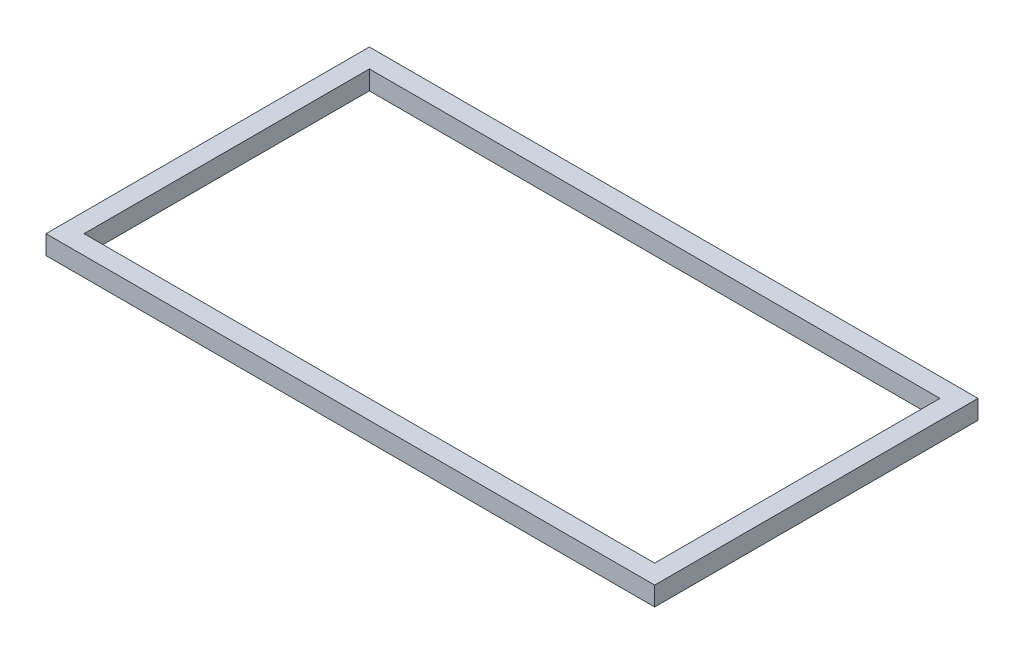
ISO-10303-21;
HEADER;
FILE_DESCRIPTION(('STEP AP214'),'2;1');
FILE_NAME('part.step','',(''),(''),'','','');
FILE_SCHEMA(('AUTOMOTIVE_DESIGN { 1 0 10303 214 1 1 1 1 }'));
ENDSEC;
DATA;
#1=APPLICATION_CONTEXT('core data for automotive mechanical design processes');
#2=APPLICATION_PROTOCOL_DEFINITION('international standard','automotive_design',2000,#1);
#3=PRODUCT_CONTEXT('',#1,'mechanical');
#4=PRODUCT('Part','Part','',(#3));
#5=PRODUCT_RELATED_PRODUCT_CATEGORY('part','',(#4));
#6=PRODUCT_DEFINITION_FORMATION('','',#4);
#7=PRODUCT_DEFINITION_CONTEXT('part definition',#1,'design');
#8=PRODUCT_DEFINITION('design','',#6,#7);
#9=PRODUCT_DEFINITION_SHAPE('','',#8);
#10=(LENGTH_UNIT() NAMED_UNIT(*) SI_UNIT(.MILLI.,.METRE.));
#11=(NAMED_UNIT(*) PLANE_ANGLE_UNIT() SI_UNIT($,.RADIAN.));
#12=(NAMED_UNIT(*) SI_UNIT($,.STERADIAN.) SOLID_ANGLE_UNIT());
#13=UNCERTAINTY_MEASURE_WITH_UNIT(LENGTH_MEASURE(1.E-05),#10,'distance_accuracy_value','');
#14=(GEOMETRIC_REPRESENTATION_CONTEXT(3) GLOBAL_UNCERTAINTY_ASSIGNED_CONTEXT((#13)) GLOBAL_UNIT_ASSIGNED_CONTEXT((#10,
#11,#12)) REPRESENTATION_CONTEXT('',''));
#15=CARTESIAN_POINT('',(0.,0.,0.));
#16=DIRECTION('',(0.,0.,1.));
#17=DIRECTION('',(1.,0.,0.));
#18=AXIS2_PLACEMENT_3D('',#15,#16,#17);
#19=CARTESIAN_POINT('',(0.,25.4,0.));
#20=DIRECTION('',(1.,0.,0.));
#21=DIRECTION('',(0.,0.,-1.));
#22=AXIS2_PLACEMENT_3D('',#19,#20,#21);
#23=PLANE('',#22);
#24=DIRECTION('',(0.,0.,1.));
#25=VECTOR('',#24,1.);
#26=CARTESIAN_POINT('',(0.,0.,0.));
#27=LINE('',#26,#25);
#28=CARTESIAN_POINT('',(0.,0.,-431.8));
#29=VERTEX_POINT('',#28);
#30=CARTESIAN_POINT('',(0.,0.,0.));
#31=VERTEX_POINT('',#30);
#32=EDGE_CURVE('E130',#29,#31,#27,.T.);
#33=ORIENTED_EDGE('',*,*,#32,.T.);
#34=DIRECTION('',(0.,-1.,0.));
#35=VECTOR('',#34,1.);
#36=CARTESIAN_POINT('',(0.,25.4,0.));
#37=LINE('',#36,#35);
#38=CARTESIAN_POINT('',(0.,25.4,0.));
#39=VERTEX_POINT('',#38);
#40=EDGE_CURVE('E11',#39,#31,#37,.T.);
#41=ORIENTED_EDGE('',*,*,#40,.F.);
#42=DIRECTION('',(0.,0.,1.));
#43=VECTOR('',#42,1.);
#44=CARTESIAN_POINT('',(0.,25.4,0.));
#45=LINE('',#44,#43);
#46=CARTESIAN_POINT('',(0.,25.4,-431.8));
#47=VERTEX_POINT('',#46);
#48=EDGE_CURVE('E134',#47,#39,#45,.T.);
#49=ORIENTED_EDGE('',*,*,#48,.F.);
#50=DIRECTION('',(0.,-1.,0.));
#51=VECTOR('',#50,1.);
#52=CARTESIAN_POINT('',(0.,25.4,-431.8));
#53=LINE('',#52,#51);
#54=EDGE_CURVE('E144',#47,#29,#53,.T.);
#55=ORIENTED_EDGE('',*,*,#54,.T.);
#56=EDGE_LOOP('',(#33,#41,#49,#55));
#57=FACE_BOUND('',#56,.T.);
#58=ADVANCED_FACE('F33',(#57),#23,.F.);
#59=CARTESIAN_POINT('',(0.,25.4,0.));
#60=DIRECTION('',(0.,0.,-1.));
#61=DIRECTION('',(-1.,0.,0.));
#62=AXIS2_PLACEMENT_3D('',#59,#60,#61);
#63=PLANE('',#62);
#64=DIRECTION('',(1.,0.,0.));
#65=VECTOR('',#64,1.);
#66=CARTESIAN_POINT('',(0.,0.,0.));
#67=LINE('',#66,#65);
#68=CARTESIAN_POINT('',(812.8,0.,0.));
#69=VERTEX_POINT('',#68);
#70=EDGE_CURVE('E147',#31,#69,#67,.T.);
#71=ORIENTED_EDGE('',*,*,#70,.T.);
#72=DIRECTION('',(0.,-1.,0.));
#73=VECTOR('',#72,1.);
#74=CARTESIAN_POINT('',(812.8,25.4,0.));
#75=LINE('',#74,#73);
#76=CARTESIAN_POINT('',(812.8,25.4,0.));
#77=VERTEX_POINT('',#76);
#78=EDGE_CURVE('E40',#77,#69,#75,.T.);
#79=ORIENTED_EDGE('',*,*,#78,.F.);
#80=DIRECTION('',(1.,0.,0.));
#81=VECTOR('',#80,1.);
#82=CARTESIAN_POINT('',(0.,25.4,0.));
#83=LINE('',#82,#81);
#84=EDGE_CURVE('E137',#39,#77,#83,.T.);
#85=ORIENTED_EDGE('',*,*,#84,.F.);
#86=ORIENTED_EDGE('',*,*,#40,.T.);
#87=EDGE_LOOP('',(#71,#79,#85,#86));
#88=FACE_BOUND('',#87,.T.);
#89=ADVANCED_FACE('F175',(#88),#63,.F.);
#90=CARTESIAN_POINT('',(812.8,25.4,0.));
#91=DIRECTION('',(-1.,0.,0.));
#92=DIRECTION('',(0.,0.,1.));
#93=AXIS2_PLACEMENT_3D('',#90,#91,#92);
#94=PLANE('',#93);
#95=DIRECTION('',(0.,0.,-1.));
#96=VECTOR('',#95,1.);
#97=CARTESIAN_POINT('',(812.8,0.,0.));
#98=LINE('',#97,#96);
#99=CARTESIAN_POINT('',(812.8,0.,-431.8));
#100=VERTEX_POINT('',#99);
#101=EDGE_CURVE('E149',#69,#100,#98,.T.);
#102=ORIENTED_EDGE('',*,*,#101,.T.);
#103=DIRECTION('',(0.,-1.,0.));
#104=VECTOR('',#103,1.);
#105=CARTESIAN_POINT('',(812.8,25.4,-431.8));
#106=LINE('',#105,#104);
#107=CARTESIAN_POINT('',(812.8,25.4,-431.8));
#108=VERTEX_POINT('',#107);
#109=EDGE_CURVE('E154',#108,#100,#106,.T.);
#110=ORIENTED_EDGE('',*,*,#109,.F.);
#111=DIRECTION('',(0.,0.,-1.));
#112=VECTOR('',#111,1.);
#113=CARTESIAN_POINT('',(812.8,25.4,0.));
#114=LINE('',#113,#112);
#115=EDGE_CURVE('E140',#77,#108,#114,.T.);
#116=ORIENTED_EDGE('',*,*,#115,.F.);
#117=ORIENTED_EDGE('',*,*,#78,.T.);
#118=EDGE_LOOP('',(#102,#110,#116,#117));
#119=FACE_BOUND('',#118,.T.);
#120=ADVANCED_FACE('F161',(#119),#94,.F.);
#121=CARTESIAN_POINT('',(0.,25.4,-431.8));
#122=DIRECTION('',(0.,0.,1.));
#123=DIRECTION('',(1.,0.,0.));
#124=AXIS2_PLACEMENT_3D('',#121,#122,#123);
#125=PLANE('',#124);
#126=DIRECTION('',(-1.,0.,0.));
#127=VECTOR('',#126,1.);
#128=CARTESIAN_POINT('',(0.,0.,-431.8));
#129=LINE('',#128,#127);
#130=EDGE_CURVE('E138',#100,#29,#129,.T.);
#131=ORIENTED_EDGE('',*,*,#130,.T.);
#132=ORIENTED_EDGE('',*,*,#54,.F.);
#133=DIRECTION('',(-1.,0.,0.));
#134=VECTOR('',#133,1.);
#135=CARTESIAN_POINT('',(0.,25.4,-431.8));
#136=LINE('',#135,#134);
#137=EDGE_CURVE('E142',#108,#47,#136,.T.);
#138=ORIENTED_EDGE('',*,*,#137,.F.);
#139=ORIENTED_EDGE('',*,*,#109,.T.);
#140=EDGE_LOOP('',(#131,#132,#138,#139));
#141=FACE_BOUND('',#140,.T.);
#142=ADVANCED_FACE('F168',(#141),#125,.F.);
#143=CARTESIAN_POINT('',(0.,25.4,0.));
#144=DIRECTION('',(0.,-1.,0.));
#145=DIRECTION('',(0.,0.,-1.));
#146=AXIS2_PLACEMENT_3D('',#143,#144,#145);
#147=PLANE('',#146);
#148=DIRECTION('',(1.,0.,0.));
#149=VECTOR('',#148,1.);
#150=CARTESIAN_POINT('',(25.4,25.4,-25.4));
#151=LINE('',#150,#149);
#152=CARTESIAN_POINT('',(25.4,25.4,-25.4));
#153=VERTEX_POINT('',#152);
#154=CARTESIAN_POINT('',(787.4,25.4,-25.4000000000002));
#155=VERTEX_POINT('',#154);
#156=EDGE_CURVE('E124',#153,#155,#151,.T.);
#157=ORIENTED_EDGE('',*,*,#156,.F.);
#158=DIRECTION('',(0.,0.,1.));
#159=VECTOR('',#158,1.);
#160=CARTESIAN_POINT('',(25.4,25.4,-25.4));
#161=LINE('',#160,#159);
#162=CARTESIAN_POINT('',(25.3999999999999,25.4,-406.4));
#163=VERTEX_POINT('',#162);
#164=EDGE_CURVE('E47',#163,#153,#161,.T.);
#165=ORIENTED_EDGE('',*,*,#164,.F.);
#166=DIRECTION('',(-1.,0.,0.));
#167=VECTOR('',#166,1.);
#168=CARTESIAN_POINT('',(25.3999999999999,25.4,-406.4));
#169=LINE('',#168,#167);
#170=CARTESIAN_POINT('',(787.4,25.4,-406.4));
#171=VERTEX_POINT('',#170);
#172=EDGE_CURVE('E115',#171,#163,#169,.T.);
#173=ORIENTED_EDGE('',*,*,#172,.F.);
#174=DIRECTION('',(0.,0.,-1.));
#175=VECTOR('',#174,1.);
#176=CARTESIAN_POINT('',(787.4,25.4,-25.4000000000002));
#177=LINE('',#176,#175);
#178=EDGE_CURVE('E118',#155,#171,#177,.T.);
#179=ORIENTED_EDGE('',*,*,#178,.F.);
#180=EDGE_LOOP('',(#157,#165,#173,#179));
#181=FACE_BOUND('',#180,.T.);
#182=ORIENTED_EDGE('',*,*,#48,.T.);
#183=ORIENTED_EDGE('',*,*,#84,.T.);
#184=ORIENTED_EDGE('',*,*,#115,.T.);
#185=ORIENTED_EDGE('',*,*,#137,.T.);
#186=EDGE_LOOP('',(#182,#183,#184,#185));
#187=FACE_BOUND('',#186,.T.);
#188=ADVANCED_FACE('F174',(#181,#187),#147,.F.);
#189=CARTESIAN_POINT('',(0.,0.,0.));
#190=DIRECTION('',(0.,-1.,0.));
#191=DIRECTION('',(0.,0.,-1.));
#192=AXIS2_PLACEMENT_3D('',#189,#190,#191);
#193=PLANE('',#192);
#194=DIRECTION('',(0.,0.,1.));
#195=VECTOR('',#194,1.);
#196=CARTESIAN_POINT('',(25.4,0.,-25.4));
#197=LINE('',#196,#195);
#198=CARTESIAN_POINT('',(25.3999999999999,0.,-406.4));
#199=VERTEX_POINT('',#198);
#200=CARTESIAN_POINT('',(25.4,0.,-25.4));
#201=VERTEX_POINT('',#200);
#202=EDGE_CURVE('E99',#199,#201,#197,.T.);
#203=ORIENTED_EDGE('',*,*,#202,.T.);
#204=DIRECTION('',(1.,0.,0.));
#205=VECTOR('',#204,1.);
#206=CARTESIAN_POINT('',(25.4,0.,-25.4));
#207=LINE('',#206,#205);
#208=CARTESIAN_POINT('',(787.4,0.,-25.4000000000002));
#209=VERTEX_POINT('',#208);
#210=EDGE_CURVE('E108',#201,#209,#207,.T.);
#211=ORIENTED_EDGE('',*,*,#210,.T.);
#212=DIRECTION('',(0.,0.,-1.));
#213=VECTOR('',#212,1.);
#214=CARTESIAN_POINT('',(787.4,0.,-25.4000000000002));
#215=LINE('',#214,#213);
#216=CARTESIAN_POINT('',(787.4,0.,-406.4));
#217=VERTEX_POINT('',#216);
#218=EDGE_CURVE('E55',#209,#217,#215,.T.);
#219=ORIENTED_EDGE('',*,*,#218,.T.);
#220=DIRECTION('',(-1.,0.,0.));
#221=VECTOR('',#220,1.);
#222=CARTESIAN_POINT('',(25.3999999999999,0.,-406.4));
#223=LINE('',#222,#221);
#224=EDGE_CURVE('E105',#217,#199,#223,.T.);
#225=ORIENTED_EDGE('',*,*,#224,.T.);
#226=EDGE_LOOP('',(#203,#211,#219,#225));
#227=FACE_BOUND('',#226,.T.);
#228=ORIENTED_EDGE('',*,*,#32,.F.);
#229=ORIENTED_EDGE('',*,*,#130,.F.);
#230=ORIENTED_EDGE('',*,*,#101,.F.);
#231=ORIENTED_EDGE('',*,*,#70,.F.);
#232=EDGE_LOOP('',(#228,#229,#230,#231));
#233=FACE_BOUND('',#232,.T.);
#234=ADVANCED_FACE('F112',(#227,#233),#193,.T.);
#235=CARTESIAN_POINT('',(25.4,0.,-25.4));
#236=DIRECTION('',(-1.,0.,0.));
#237=DIRECTION('',(0.,0.,1.));
#238=AXIS2_PLACEMENT_3D('',#235,#236,#237);
#239=PLANE('',#238);
#240=ORIENTED_EDGE('',*,*,#164,.T.);
#241=DIRECTION('',(0.,1.,0.));
#242=VECTOR('',#241,1.);
#243=CARTESIAN_POINT('',(25.4,0.,-25.4));
#244=LINE('',#243,#242);
#245=EDGE_CURVE('E95',#201,#153,#244,.T.);
#246=ORIENTED_EDGE('',*,*,#245,.F.);
#247=ORIENTED_EDGE('',*,*,#202,.F.);
#248=DIRECTION('',(0.,1.,0.));
#249=VECTOR('',#248,1.);
#250=CARTESIAN_POINT('',(25.3999999999999,0.,-406.4));
#251=LINE('',#250,#249);
#252=EDGE_CURVE('E128',#199,#163,#251,.T.);
#253=ORIENTED_EDGE('',*,*,#252,.T.);
#254=EDGE_LOOP('',(#240,#246,#247,#253));
#255=FACE_BOUND('',#254,.T.);
#256=ADVANCED_FACE('F97',(#255),#239,.F.);
#257=CARTESIAN_POINT('',(25.3999999999999,0.,-406.4));
#258=DIRECTION('',(0.,0.,-1.));
#259=DIRECTION('',(-1.,0.,0.));
#260=AXIS2_PLACEMENT_3D('',#257,#258,#259);
#261=PLANE('',#260);
#262=ORIENTED_EDGE('',*,*,#172,.T.);
#263=ORIENTED_EDGE('',*,*,#252,.F.);
#264=ORIENTED_EDGE('',*,*,#224,.F.);
#265=DIRECTION('',(0.,1.,0.));
#266=VECTOR('',#265,1.);
#267=CARTESIAN_POINT('',(787.4,0.,-406.4));
#268=LINE('',#267,#266);
#269=EDGE_CURVE('E131',#217,#171,#268,.T.);
#270=ORIENTED_EDGE('',*,*,#269,.T.);
#271=EDGE_LOOP('',(#262,#263,#264,#270));
#272=FACE_BOUND('',#271,.T.);
#273=ADVANCED_FACE('F192',(#272),#261,.F.);
#274=CARTESIAN_POINT('',(787.4,0.,-25.4000000000002));
#275=DIRECTION('',(1.,0.,0.));
#276=DIRECTION('',(0.,0.,-1.));
#277=AXIS2_PLACEMENT_3D('',#274,#275,#276);
#278=PLANE('',#277);
#279=ORIENTED_EDGE('',*,*,#178,.T.);
#280=ORIENTED_EDGE('',*,*,#269,.F.);
#281=ORIENTED_EDGE('',*,*,#218,.F.);
#282=DIRECTION('',(0.,1.,0.));
#283=VECTOR('',#282,1.);
#284=CARTESIAN_POINT('',(787.4,0.,-25.4000000000002));
#285=LINE('',#284,#283);
#286=EDGE_CURVE('E104',#209,#155,#285,.T.);
#287=ORIENTED_EDGE('',*,*,#286,.T.);
#288=EDGE_LOOP('',(#279,#280,#281,#287));
#289=FACE_BOUND('',#288,.T.);
#290=ADVANCED_FACE('F195',(#289),#278,.F.);
#291=CARTESIAN_POINT('',(25.4,0.,-25.4));
#292=DIRECTION('',(0.,0.,1.));
#293=DIRECTION('',(1.,0.,0.));
#294=AXIS2_PLACEMENT_3D('',#291,#292,#293);
#295=PLANE('',#294);
#296=ORIENTED_EDGE('',*,*,#156,.T.);
#297=ORIENTED_EDGE('',*,*,#286,.F.);
#298=ORIENTED_EDGE('',*,*,#210,.F.);
#299=ORIENTED_EDGE('',*,*,#245,.T.);
#300=EDGE_LOOP('',(#296,#297,#298,#299));
#301=FACE_BOUND('',#300,.T.);
#302=ADVANCED_FACE('F109',(#301),#295,.F.);
#303=CLOSED_SHELL('',(#58,#89,#120,#142,#188,#234,#256,#273,#290,#302));
#304=MANIFOLD_SOLID_BREP('B2',#303);
#305=ADVANCED_BREP_SHAPE_REPRESENTATION('',(#18,#304),#14);
#306=SHAPE_DEFINITION_REPRESENTATION(#9,#305);
ENDSEC;
END-ISO-10303-21;
